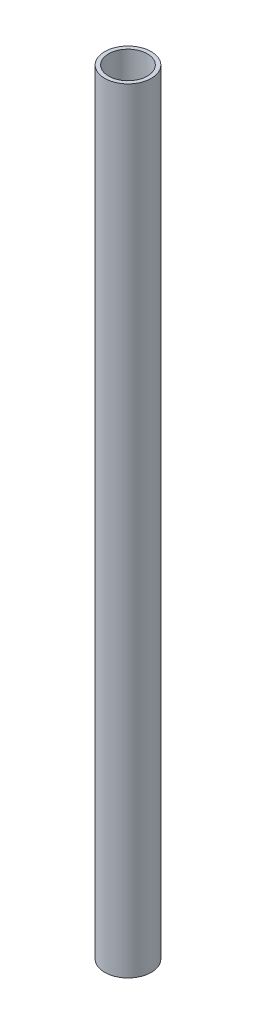
ISO-10303-21;
HEADER;
FILE_DESCRIPTION(('STEP AP214'),'2;1');
FILE_NAME('part.step','',(''),(''),'','','');
FILE_SCHEMA(('AUTOMOTIVE_DESIGN { 1 0 10303 214 1 1 1 1 }'));
ENDSEC;
DATA;
#1=APPLICATION_CONTEXT('core data for automotive mechanical design processes');
#2=APPLICATION_PROTOCOL_DEFINITION('international standard','automotive_design',2000,#1);
#3=PRODUCT_CONTEXT('',#1,'mechanical');
#4=PRODUCT('Part','Part','',(#3));
#5=PRODUCT_RELATED_PRODUCT_CATEGORY('part','',(#4));
#6=PRODUCT_DEFINITION_FORMATION('','',#4);
#7=PRODUCT_DEFINITION_CONTEXT('part definition',#1,'design');
#8=PRODUCT_DEFINITION('design','',#6,#7);
#9=PRODUCT_DEFINITION_SHAPE('','',#8);
#10=(LENGTH_UNIT() NAMED_UNIT(*) SI_UNIT(.MILLI.,.METRE.));
#11=(NAMED_UNIT(*) PLANE_ANGLE_UNIT() SI_UNIT($,.RADIAN.));
#12=(NAMED_UNIT(*) SI_UNIT($,.STERADIAN.) SOLID_ANGLE_UNIT());
#13=UNCERTAINTY_MEASURE_WITH_UNIT(LENGTH_MEASURE(1.E-05),#10,'distance_accuracy_value','');
#14=(GEOMETRIC_REPRESENTATION_CONTEXT(3) GLOBAL_UNCERTAINTY_ASSIGNED_CONTEXT((#13)) GLOBAL_UNIT_ASSIGNED_CONTEXT((#10,
#11,#12)) REPRESENTATION_CONTEXT('',''));
#15=CARTESIAN_POINT('',(0.,0.,0.));
#16=DIRECTION('',(0.,0.,1.));
#17=DIRECTION('',(1.,0.,0.));
#18=AXIS2_PLACEMENT_3D('',#15,#16,#17);
#19=CARTESIAN_POINT('',(0.,500.,0.));
#20=DIRECTION('',(0.,1.,0.));
#21=DIRECTION('',(0.,0.,1.));
#22=AXIS2_PLACEMENT_3D('',#19,#20,#21);
#23=PLANE('',#22);
#24=CARTESIAN_POINT('',(0.,500.,0.));
#25=DIRECTION('',(0.,1.,0.));
#26=DIRECTION('',(0.,0.,1.));
#27=AXIS2_PLACEMENT_3D('',#24,#25,#26);
#28=CIRCLE('',#27,15.);
#29=CARTESIAN_POINT('',(0.,500.,15.));
#30=VERTEX_POINT('',#29);
#31=EDGE_CURVE('E10',#30,#30,#28,.T.);
#32=ORIENTED_EDGE('',*,*,#31,.T.);
#33=EDGE_LOOP('',(#32));
#34=FACE_BOUND('',#33,.T.);
#35=CARTESIAN_POINT('',(0.,500.,0.));
#36=DIRECTION('',(0.,1.,0.));
#37=DIRECTION('',(0.,0.,1.));
#38=AXIS2_PLACEMENT_3D('',#35,#36,#37);
#39=CIRCLE('',#38,12.5);
#40=CARTESIAN_POINT('',(0.,500.,12.5));
#41=VERTEX_POINT('',#40);
#42=EDGE_CURVE('E50',#41,#41,#39,.T.);
#43=ORIENTED_EDGE('',*,*,#42,.F.);
#44=EDGE_LOOP('',(#43));
#45=FACE_BOUND('',#44,.T.);
#46=ADVANCED_FACE('F37',(#34,#45),#23,.T.);
#47=CARTESIAN_POINT('',(0.,0.,0.));
#48=DIRECTION('',(0.,1.,0.));
#49=DIRECTION('',(0.,0.,1.));
#50=AXIS2_PLACEMENT_3D('',#47,#48,#49);
#51=PLANE('',#50);
#52=CARTESIAN_POINT('',(0.,0.,0.));
#53=DIRECTION('',(0.,1.,0.));
#54=DIRECTION('',(0.,0.,1.));
#55=AXIS2_PLACEMENT_3D('',#52,#53,#54);
#56=CIRCLE('',#55,15.);
#57=CARTESIAN_POINT('',(0.,0.,15.));
#58=VERTEX_POINT('',#57);
#59=EDGE_CURVE('E41',#58,#58,#56,.T.);
#60=ORIENTED_EDGE('',*,*,#59,.F.);
#61=EDGE_LOOP('',(#60));
#62=FACE_BOUND('',#61,.T.);
#63=CARTESIAN_POINT('',(0.,0.,0.));
#64=DIRECTION('',(0.,1.,0.));
#65=DIRECTION('',(0.,0.,1.));
#66=AXIS2_PLACEMENT_3D('',#63,#64,#65);
#67=CIRCLE('',#66,12.5);
#68=CARTESIAN_POINT('',(0.,0.,12.5));
#69=VERTEX_POINT('',#68);
#70=EDGE_CURVE('E52',#69,#69,#67,.T.);
#71=ORIENTED_EDGE('',*,*,#70,.T.);
#72=EDGE_LOOP('',(#71));
#73=FACE_BOUND('',#72,.T.);
#74=ADVANCED_FACE('F64',(#62,#73),#51,.F.);
#75=CARTESIAN_POINT('',(0.,500.,0.));
#76=DIRECTION('',(0.,-1.,0.));
#77=DIRECTION('',(0.,0.,-1.));
#78=AXIS2_PLACEMENT_3D('',#75,#76,#77);
#79=CYLINDRICAL_SURFACE('',#78,15.);
#80=ORIENTED_EDGE('',*,*,#31,.F.);
#81=EDGE_LOOP('',(#80));
#82=FACE_BOUND('',#81,.T.);
#83=ORIENTED_EDGE('',*,*,#59,.T.);
#84=EDGE_LOOP('',(#83));
#85=FACE_BOUND('',#84,.T.);
#86=ADVANCED_FACE('F39',(#82,#85),#79,.T.);
#87=CARTESIAN_POINT('',(0.,500.,0.));
#88=DIRECTION('',(0.,-1.,0.));
#89=DIRECTION('',(0.,0.,-1.));
#90=AXIS2_PLACEMENT_3D('',#87,#88,#89);
#91=CYLINDRICAL_SURFACE('',#90,12.5);
#92=ORIENTED_EDGE('',*,*,#42,.T.);
#93=EDGE_LOOP('',(#92));
#94=FACE_BOUND('',#93,.T.);
#95=ORIENTED_EDGE('',*,*,#70,.F.);
#96=EDGE_LOOP('',(#95));
#97=FACE_BOUND('',#96,.T.);
#98=ADVANCED_FACE('F60',(#94,#97),#91,.F.);
#99=CLOSED_SHELL('',(#46,#74,#86,#98));
#100=MANIFOLD_SOLID_BREP('B2',#99);
#101=ADVANCED_BREP_SHAPE_REPRESENTATION('',(#18,#100),#14);
#102=SHAPE_DEFINITION_REPRESENTATION(#9,#101);
ENDSEC;
END-ISO-10303-21;
